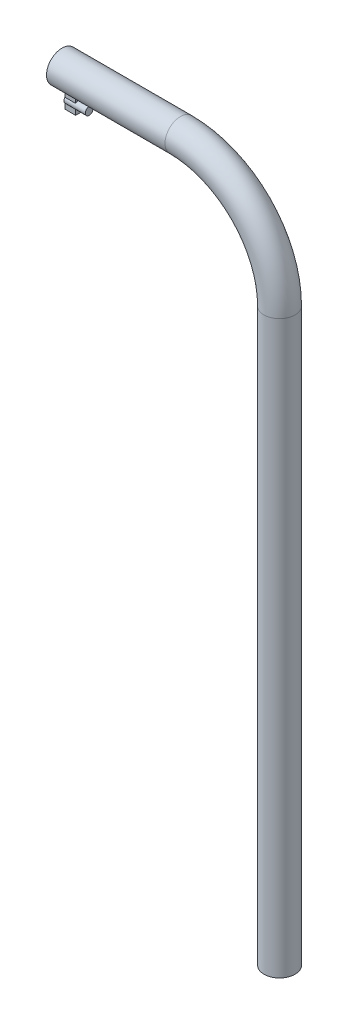
ISO-10303-21;
HEADER;
FILE_DESCRIPTION(('STEP AP214'),'2;1');
FILE_NAME('part.step','',(''),(''),'','','');
FILE_SCHEMA(('AUTOMOTIVE_DESIGN { 1 0 10303 214 1 1 1 1 }'));
ENDSEC;
DATA;
#1=APPLICATION_CONTEXT('core data for automotive mechanical design processes');
#2=APPLICATION_PROTOCOL_DEFINITION('international standard','automotive_design',2000,#1);
#3=PRODUCT_CONTEXT('',#1,'mechanical');
#4=PRODUCT('Part','Part','',(#3));
#5=PRODUCT_RELATED_PRODUCT_CATEGORY('part','',(#4));
#6=PRODUCT_DEFINITION_FORMATION('','',#4);
#7=PRODUCT_DEFINITION_CONTEXT('part definition',#1,'design');
#8=PRODUCT_DEFINITION('design','',#6,#7);
#9=PRODUCT_DEFINITION_SHAPE('','',#8);
#10=(LENGTH_UNIT() NAMED_UNIT(*) SI_UNIT(.MILLI.,.METRE.));
#11=(NAMED_UNIT(*) PLANE_ANGLE_UNIT() SI_UNIT($,.RADIAN.));
#12=(NAMED_UNIT(*) SI_UNIT($,.STERADIAN.) SOLID_ANGLE_UNIT());
#13=UNCERTAINTY_MEASURE_WITH_UNIT(LENGTH_MEASURE(1.E-05),#10,'distance_accuracy_value','');
#14=(GEOMETRIC_REPRESENTATION_CONTEXT(3) GLOBAL_UNCERTAINTY_ASSIGNED_CONTEXT((#13)) GLOBAL_UNIT_ASSIGNED_CONTEXT((#10,
#11,#12)) REPRESENTATION_CONTEXT('',''));
#15=CARTESIAN_POINT('',(0.,0.,0.));
#16=DIRECTION('',(0.,0.,1.));
#17=DIRECTION('',(1.,0.,0.));
#18=AXIS2_PLACEMENT_3D('',#15,#16,#17);
#19=CARTESIAN_POINT('',(-109.,172.,1.5));
#20=DIRECTION('',(0.,0.,-1.));
#21=DIRECTION('',(-1.,0.,0.));
#22=AXIS2_PLACEMENT_3D('',#19,#20,#21);
#23=PLANE('',#22);
#24=DIRECTION('',(-1.,0.,0.));
#25=VECTOR('',#24,1.);
#26=CARTESIAN_POINT('',(-109.,161.677124344468,1.5));
#27=LINE('',#26,#25);
#28=CARTESIAN_POINT('',(-109.,161.677124344468,1.5));
#29=VERTEX_POINT('',#28);
#30=CARTESIAN_POINT('',(-103.5,161.677124344468,1.5));
#31=VERTEX_POINT('',#30);
#32=EDGE_CURVE('E53',#29,#31,#27,.F.);
#33=ORIENTED_EDGE('',*,*,#32,.F.);
#34=DIRECTION('',(0.,-1.,0.));
#35=VECTOR('',#34,1.);
#36=CARTESIAN_POINT('',(-109.,172.,1.5));
#37=LINE('',#36,#35);
#38=CARTESIAN_POINT('',(-109.,159.,1.5));
#39=VERTEX_POINT('',#38);
#40=EDGE_CURVE('E158',#29,#39,#37,.T.);
#41=ORIENTED_EDGE('',*,*,#40,.T.);
#42=DIRECTION('',(1.,0.,0.));
#43=VECTOR('',#42,1.);
#44=CARTESIAN_POINT('',(-109.,159.,1.5));
#45=LINE('',#44,#43);
#46=CARTESIAN_POINT('',(-103.5,159.,1.5));
#47=VERTEX_POINT('',#46);
#48=EDGE_CURVE('E142',#39,#47,#45,.T.);
#49=ORIENTED_EDGE('',*,*,#48,.T.);
#50=DIRECTION('',(0.,-1.,0.));
#51=VECTOR('',#50,1.);
#52=CARTESIAN_POINT('',(-103.5,172.,1.5));
#53=LINE('',#52,#51);
#54=EDGE_CURVE('E151',#31,#47,#53,.T.);
#55=ORIENTED_EDGE('',*,*,#54,.F.);
#56=EDGE_LOOP('',(#33,#41,#49,#55));
#57=FACE_BOUND('',#56,.T.);
#58=ADVANCED_FACE('F39',(#57),#23,.F.);
#59=DIRECTION('',(-1.,0.,0.));
#60=VECTOR('',#59,1.);
#61=CARTESIAN_POINT('',(-109.,164.322875655532,1.5));
#62=LINE('',#61,#60);
#63=CARTESIAN_POINT('',(-103.5,164.322875655532,1.5));
#64=VERTEX_POINT('',#63);
#65=CARTESIAN_POINT('',(-109.,164.322875655532,1.5));
#66=VERTEX_POINT('',#65);
#67=EDGE_CURVE('E140',#64,#66,#62,.T.);
#68=ORIENTED_EDGE('',*,*,#67,.F.);
#69=CARTESIAN_POINT('',(-103.5,168.141883177249,1.5));
#70=VERTEX_POINT('',#69);
#71=EDGE_CURVE('E155',#70,#64,#53,.T.);
#72=ORIENTED_EDGE('',*,*,#71,.F.);
#73=DIRECTION('',(-1.,0.,0.));
#74=VECTOR('',#73,1.);
#75=CARTESIAN_POINT('',(-51.,168.141883177249,1.5));
#76=LINE('',#75,#74);
#77=CARTESIAN_POINT('',(-109.,168.141883177249,1.5));
#78=VERTEX_POINT('',#77);
#79=EDGE_CURVE('E176',#78,#70,#76,.F.);
#80=ORIENTED_EDGE('',*,*,#79,.F.);
#81=EDGE_CURVE('E65',#78,#66,#37,.T.);
#82=ORIENTED_EDGE('',*,*,#81,.T.);
#83=EDGE_LOOP('',(#68,#72,#80,#82));
#84=FACE_BOUND('',#83,.T.);
#85=ADVANCED_FACE('F183',(#84),#23,.F.);
#86=CARTESIAN_POINT('',(-103.5,172.,1.5));
#87=DIRECTION('',(-1.,0.,0.));
#88=DIRECTION('',(0.,0.,1.));
#89=AXIS2_PLACEMENT_3D('',#86,#87,#88);
#90=PLANE('',#89);
#91=CARTESIAN_POINT('',(-103.5,163.,0.));
#92=DIRECTION('',(-1.,0.,0.));
#93=DIRECTION('',(0.,0.,1.));
#94=AXIS2_PLACEMENT_3D('',#91,#92,#93);
#95=CIRCLE('',#94,2.);
#96=CARTESIAN_POINT('',(-103.5,161.677124344468,-1.5));
#97=VERTEX_POINT('',#96);
#98=EDGE_CURVE('E125',#31,#97,#95,.F.);
#99=ORIENTED_EDGE('',*,*,#98,.F.);
#100=ORIENTED_EDGE('',*,*,#54,.T.);
#101=DIRECTION('',(0.,0.,-1.));
#102=VECTOR('',#101,1.);
#103=CARTESIAN_POINT('',(-103.5,159.,1.5));
#104=LINE('',#103,#102);
#105=CARTESIAN_POINT('',(-103.5,159.,-1.5));
#106=VERTEX_POINT('',#105);
#107=EDGE_CURVE('E144',#47,#106,#104,.T.);
#108=ORIENTED_EDGE('',*,*,#107,.T.);
#109=DIRECTION('',(0.,-1.,0.));
#110=VECTOR('',#109,1.);
#111=CARTESIAN_POINT('',(-103.5,172.,-1.5));
#112=LINE('',#111,#110);
#113=EDGE_CURVE('E149',#97,#106,#112,.T.);
#114=ORIENTED_EDGE('',*,*,#113,.F.);
#115=EDGE_LOOP('',(#99,#100,#108,#114));
#116=FACE_BOUND('',#115,.T.);
#117=ADVANCED_FACE('F192',(#116),#90,.F.);
#118=CARTESIAN_POINT('',(-103.5,172.,-1.5));
#119=DIRECTION('',(0.,0.,1.));
#120=DIRECTION('',(1.,0.,0.));
#121=AXIS2_PLACEMENT_3D('',#118,#119,#120);
#122=PLANE('',#121);
#123=DIRECTION('',(-1.,0.,0.));
#124=VECTOR('',#123,1.);
#125=CARTESIAN_POINT('',(-109.,164.322875655532,-1.5));
#126=LINE('',#125,#124);
#127=CARTESIAN_POINT('',(-109.,164.322875655532,-1.5));
#128=VERTEX_POINT('',#127);
#129=CARTESIAN_POINT('',(-103.5,164.322875655532,-1.5));
#130=VERTEX_POINT('',#129);
#131=EDGE_CURVE('E11',#128,#130,#126,.F.);
#132=ORIENTED_EDGE('',*,*,#131,.F.);
#133=DIRECTION('',(0.,-1.,0.));
#134=VECTOR('',#133,1.);
#135=CARTESIAN_POINT('',(-109.,172.,-1.5));
#136=LINE('',#135,#134);
#137=CARTESIAN_POINT('',(-109.,168.141883177249,-1.5));
#138=VERTEX_POINT('',#137);
#139=EDGE_CURVE('E112',#138,#128,#136,.T.);
#140=ORIENTED_EDGE('',*,*,#139,.F.);
#141=DIRECTION('',(-1.,0.,0.));
#142=VECTOR('',#141,1.);
#143=CARTESIAN_POINT('',(-51.,168.141883177249,-1.5));
#144=LINE('',#143,#142);
#145=CARTESIAN_POINT('',(-103.5,168.141883177249,-1.5));
#146=VERTEX_POINT('',#145);
#147=EDGE_CURVE('E166',#146,#138,#144,.T.);
#148=ORIENTED_EDGE('',*,*,#147,.F.);
#149=EDGE_CURVE('E146',#146,#130,#112,.T.);
#150=ORIENTED_EDGE('',*,*,#149,.T.);
#151=EDGE_LOOP('',(#132,#140,#148,#150));
#152=FACE_BOUND('',#151,.T.);
#153=ADVANCED_FACE('F186',(#152),#122,.F.);
#154=DIRECTION('',(-1.,0.,0.));
#155=VECTOR('',#154,1.);
#156=CARTESIAN_POINT('',(-109.,161.677124344468,-1.5));
#157=LINE('',#156,#155);
#158=CARTESIAN_POINT('',(-109.,161.677124344468,-1.5));
#159=VERTEX_POINT('',#158);
#160=EDGE_CURVE('E50',#97,#159,#157,.T.);
#161=ORIENTED_EDGE('',*,*,#160,.F.);
#162=ORIENTED_EDGE('',*,*,#113,.T.);
#163=DIRECTION('',(-1.,0.,0.));
#164=VECTOR('',#163,1.);
#165=CARTESIAN_POINT('',(-103.5,159.,-1.5));
#166=LINE('',#165,#164);
#167=CARTESIAN_POINT('',(-109.,159.,-1.5));
#168=VERTEX_POINT('',#167);
#169=EDGE_CURVE('E107',#106,#168,#166,.T.);
#170=ORIENTED_EDGE('',*,*,#169,.T.);
#171=EDGE_CURVE('E104',#159,#168,#136,.T.);
#172=ORIENTED_EDGE('',*,*,#171,.F.);
#173=EDGE_LOOP('',(#161,#162,#170,#172));
#174=FACE_BOUND('',#173,.T.);
#175=ADVANCED_FACE('F106',(#174),#122,.F.);
#176=CARTESIAN_POINT('',(-51.,176.,0.));
#177=DIRECTION('',(-1.,0.,0.));
#178=DIRECTION('',(0.,0.,1.));
#179=AXIS2_PLACEMENT_3D('',#176,#177,#178);
#180=CYLINDRICAL_SURFACE('',#179,8.);
#181=CARTESIAN_POINT('',(-112.,176.,0.));
#182=DIRECTION('',(-1.,0.,0.));
#183=DIRECTION('',(0.,0.,1.));
#184=AXIS2_PLACEMENT_3D('',#181,#182,#183);
#185=CIRCLE('',#184,8.);
#186=CARTESIAN_POINT('',(-112.,176.,8.));
#187=VERTEX_POINT('',#186);
#188=EDGE_CURVE('E163',#187,#187,#185,.T.);
#189=ORIENTED_EDGE('',*,*,#188,.F.);
#190=EDGE_LOOP('',(#189));
#191=FACE_BOUND('',#190,.T.);
#192=CARTESIAN_POINT('',(-51.,176.,0.));
#193=DIRECTION('',(-1.,0.,0.));
#194=DIRECTION('',(0.,0.,1.));
#195=AXIS2_PLACEMENT_3D('',#192,#193,#194);
#196=CIRCLE('',#195,8.);
#197=CARTESIAN_POINT('',(-51.,184.,0.));
#198=VERTEX_POINT('',#197);
#199=EDGE_CURVE('E156',#198,#198,#196,.T.);
#200=ORIENTED_EDGE('',*,*,#199,.T.);
#201=EDGE_LOOP('',(#200));
#202=FACE_BOUND('',#201,.T.);
#203=ORIENTED_EDGE('',*,*,#147,.T.);
#204=CARTESIAN_POINT('',(-109.,176.,0.));
#205=DIRECTION('',(1.,0.,0.));
#206=DIRECTION('',(0.,0.,-1.));
#207=AXIS2_PLACEMENT_3D('',#204,#205,#206);
#208=CIRCLE('',#207,8.);
#209=EDGE_CURVE('E124',#138,#78,#208,.F.);
#210=ORIENTED_EDGE('',*,*,#209,.T.);
#211=ORIENTED_EDGE('',*,*,#79,.T.);
#212=CARTESIAN_POINT('',(-103.5,176.,0.));
#213=DIRECTION('',(-1.,0.,0.));
#214=DIRECTION('',(0.,0.,1.));
#215=AXIS2_PLACEMENT_3D('',#212,#213,#214);
#216=CIRCLE('',#215,8.);
#217=EDGE_CURVE('E173',#70,#146,#216,.F.);
#218=ORIENTED_EDGE('',*,*,#217,.T.);
#219=EDGE_LOOP('',(#203,#210,#211,#218));
#220=FACE_BOUND('',#219,.T.);
#221=ADVANCED_FACE('F181',(#191,#202,#220),#180,.T.);
#222=CARTESIAN_POINT('',(0.,125.,0.));
#223=DIRECTION('',(0.,-1.,0.));
#224=DIRECTION('',(0.,0.,-1.));
#225=AXIS2_PLACEMENT_3D('',#222,#223,#224);
#226=CYLINDRICAL_SURFACE('',#225,8.);
#227=CARTESIAN_POINT('',(0.,125.,0.));
#228=DIRECTION('',(0.,1.,0.));
#229=DIRECTION('',(0.,0.,1.));
#230=AXIS2_PLACEMENT_3D('',#227,#228,#229);
#231=CIRCLE('',#230,8.);
#232=CARTESIAN_POINT('',(8.,125.,0.));
#233=VERTEX_POINT('',#232);
#234=EDGE_CURVE('E164',#233,#233,#231,.T.);
#235=ORIENTED_EDGE('',*,*,#234,.F.);
#236=EDGE_LOOP('',(#235));
#237=FACE_BOUND('',#236,.T.);
#238=CARTESIAN_POINT('',(0.,-169.,0.));
#239=DIRECTION('',(0.,1.,0.));
#240=DIRECTION('',(0.,0.,1.));
#241=AXIS2_PLACEMENT_3D('',#238,#239,#240);
#242=CIRCLE('',#241,8.);
#243=CARTESIAN_POINT('',(0.,-169.,8.));
#244=VERTEX_POINT('',#243);
#245=EDGE_CURVE('E165',#244,#244,#242,.T.);
#246=ORIENTED_EDGE('',*,*,#245,.T.);
#247=EDGE_LOOP('',(#246));
#248=FACE_BOUND('',#247,.T.);
#249=ADVANCED_FACE('F41',(#237,#248),#226,.T.);
#250=CARTESIAN_POINT('',(0.,-169.,0.));
#251=DIRECTION('',(0.,1.,0.));
#252=DIRECTION('',(0.,0.,1.));
#253=AXIS2_PLACEMENT_3D('',#250,#251,#252);
#254=PLANE('',#253);
#255=ORIENTED_EDGE('',*,*,#245,.F.);
#256=EDGE_LOOP('',(#255));
#257=FACE_BOUND('',#256,.T.);
#258=ADVANCED_FACE('F211',(#257),#254,.F.);
#259=CARTESIAN_POINT('',(-112.,176.,0.));
#260=DIRECTION('',(-1.,0.,0.));
#261=DIRECTION('',(0.,0.,1.));
#262=AXIS2_PLACEMENT_3D('',#259,#260,#261);
#263=PLANE('',#262);
#264=ORIENTED_EDGE('',*,*,#188,.T.);
#265=EDGE_LOOP('',(#264));
#266=FACE_BOUND('',#265,.T.);
#267=ADVANCED_FACE('F208',(#266),#263,.T.);
#268=CARTESIAN_POINT('',(-51.,125.,0.));
#269=DIRECTION('',(0.,0.,1.));
#270=DIRECTION('',(1.,0.,0.));
#271=AXIS2_PLACEMENT_3D('',#268,#269,#270);
#272=TOROIDAL_SURFACE('',#271,51.,8.);
#273=CARTESIAN_POINT('',(-51.,125.,0.));
#274=DIRECTION('',(0.,0.,1.));
#275=DIRECTION('',(1.,0.,0.));
#276=AXIS2_PLACEMENT_3D('',#273,#274,#275);
#277=CIRCLE('',#276,59.);
#278=EDGE_CURVE('',#233,#198,#277,.T.);
#279=ORIENTED_EDGE('',*,*,#234,.T.);
#280=ORIENTED_EDGE('',*,*,#199,.F.);
#281=ORIENTED_EDGE('',*,*,#278,.T.);
#282=ORIENTED_EDGE('',*,*,#278,.F.);
#283=EDGE_LOOP('',(#279,#281,#280,#282));
#284=FACE_BOUND('',#283,.T.);
#285=ADVANCED_FACE('F209',(#284),#272,.T.);
#286=CARTESIAN_POINT('',(-109.,172.,-1.5));
#287=DIRECTION('',(1.,0.,0.));
#288=DIRECTION('',(0.,0.,-1.));
#289=AXIS2_PLACEMENT_3D('',#286,#287,#288);
#290=PLANE('',#289);
#291=ORIENTED_EDGE('',*,*,#139,.T.);
#292=CARTESIAN_POINT('',(-109.,163.,0.));
#293=DIRECTION('',(-1.,0.,0.));
#294=DIRECTION('',(0.,0.,1.));
#295=AXIS2_PLACEMENT_3D('',#292,#293,#294);
#296=CIRCLE('',#295,2.);
#297=EDGE_CURVE('E122',#128,#159,#296,.T.);
#298=ORIENTED_EDGE('',*,*,#297,.T.);
#299=ORIENTED_EDGE('',*,*,#171,.T.);
#300=DIRECTION('',(0.,0.,1.));
#301=VECTOR('',#300,1.);
#302=CARTESIAN_POINT('',(-109.,159.,-1.5));
#303=LINE('',#302,#301);
#304=EDGE_CURVE('E137',#168,#39,#303,.T.);
#305=ORIENTED_EDGE('',*,*,#304,.T.);
#306=ORIENTED_EDGE('',*,*,#40,.F.);
#307=EDGE_CURVE('E129',#29,#66,#296,.T.);
#308=ORIENTED_EDGE('',*,*,#307,.T.);
#309=ORIENTED_EDGE('',*,*,#81,.F.);
#310=ORIENTED_EDGE('',*,*,#209,.F.);
#311=EDGE_LOOP('',(#291,#298,#299,#305,#306,#308,#309,#310));
#312=FACE_BOUND('',#311,.T.);
#313=ADVANCED_FACE('F123',(#312),#290,.F.);
#314=EDGE_CURVE('E132',#130,#64,#95,.F.);
#315=ORIENTED_EDGE('',*,*,#314,.F.);
#316=ORIENTED_EDGE('',*,*,#149,.F.);
#317=ORIENTED_EDGE('',*,*,#217,.F.);
#318=ORIENTED_EDGE('',*,*,#71,.T.);
#319=EDGE_LOOP('',(#315,#316,#317,#318));
#320=FACE_BOUND('',#319,.T.);
#321=ADVANCED_FACE('F187',(#320),#90,.F.);
#322=CARTESIAN_POINT('',(0.,159.,0.));
#323=DIRECTION('',(0.,1.,0.));
#324=DIRECTION('',(0.,0.,1.));
#325=AXIS2_PLACEMENT_3D('',#322,#323,#324);
#326=PLANE('',#325);
#327=ORIENTED_EDGE('',*,*,#304,.F.);
#328=ORIENTED_EDGE('',*,*,#169,.F.);
#329=ORIENTED_EDGE('',*,*,#107,.F.);
#330=ORIENTED_EDGE('',*,*,#48,.F.);
#331=EDGE_LOOP('',(#327,#328,#329,#330));
#332=FACE_BOUND('',#331,.T.);
#333=ADVANCED_FACE('F271',(#332),#326,.F.);
#334=CARTESIAN_POINT('',(-109.,163.,0.));
#335=DIRECTION('',(-1.,0.,0.));
#336=DIRECTION('',(0.,0.,1.));
#337=AXIS2_PLACEMENT_3D('',#334,#335,#336);
#338=CYLINDRICAL_SURFACE('',#337,2.);
#339=CARTESIAN_POINT('',(-98.,163.,0.));
#340=DIRECTION('',(-1.,0.,0.));
#341=DIRECTION('',(0.,0.,1.));
#342=AXIS2_PLACEMENT_3D('',#339,#340,#341);
#343=CIRCLE('',#342,2.);
#344=CARTESIAN_POINT('',(-98.,163.,2.));
#345=VERTEX_POINT('',#344);
#346=EDGE_CURVE('E130',#345,#345,#343,.T.);
#347=ORIENTED_EDGE('',*,*,#346,.T.);
#348=EDGE_LOOP('',(#347));
#349=FACE_BOUND('',#348,.T.);
#350=ORIENTED_EDGE('',*,*,#314,.T.);
#351=ORIENTED_EDGE('',*,*,#67,.T.);
#352=ORIENTED_EDGE('',*,*,#307,.F.);
#353=ORIENTED_EDGE('',*,*,#32,.T.);
#354=ORIENTED_EDGE('',*,*,#98,.T.);
#355=ORIENTED_EDGE('',*,*,#160,.T.);
#356=ORIENTED_EDGE('',*,*,#297,.F.);
#357=ORIENTED_EDGE('',*,*,#131,.T.);
#358=EDGE_LOOP('',(#350,#351,#352,#353,#354,#355,#356,#357));
#359=FACE_BOUND('',#358,.T.);
#360=ADVANCED_FACE('F119',(#349,#359),#338,.T.);
#361=CARTESIAN_POINT('',(-98.,163.,0.));
#362=DIRECTION('',(-1.,0.,0.));
#363=DIRECTION('',(0.,0.,1.));
#364=AXIS2_PLACEMENT_3D('',#361,#362,#363);
#365=PLANE('',#364);
#366=ORIENTED_EDGE('',*,*,#346,.F.);
#367=EDGE_LOOP('',(#366));
#368=FACE_BOUND('',#367,.T.);
#369=ADVANCED_FACE('F308',(#368),#365,.F.);
#370=CLOSED_SHELL('',(#58,#85,#117,#153,#175,#221,#249,#258,#267,#285,#313,#321,#333,#360,#369));
#371=MANIFOLD_SOLID_BREP('B2',#370);
#372=ADVANCED_BREP_SHAPE_REPRESENTATION('',(#18,#371),#14);
#373=SHAPE_DEFINITION_REPRESENTATION(#9,#372);
ENDSEC;
END-ISO-10303-21;
